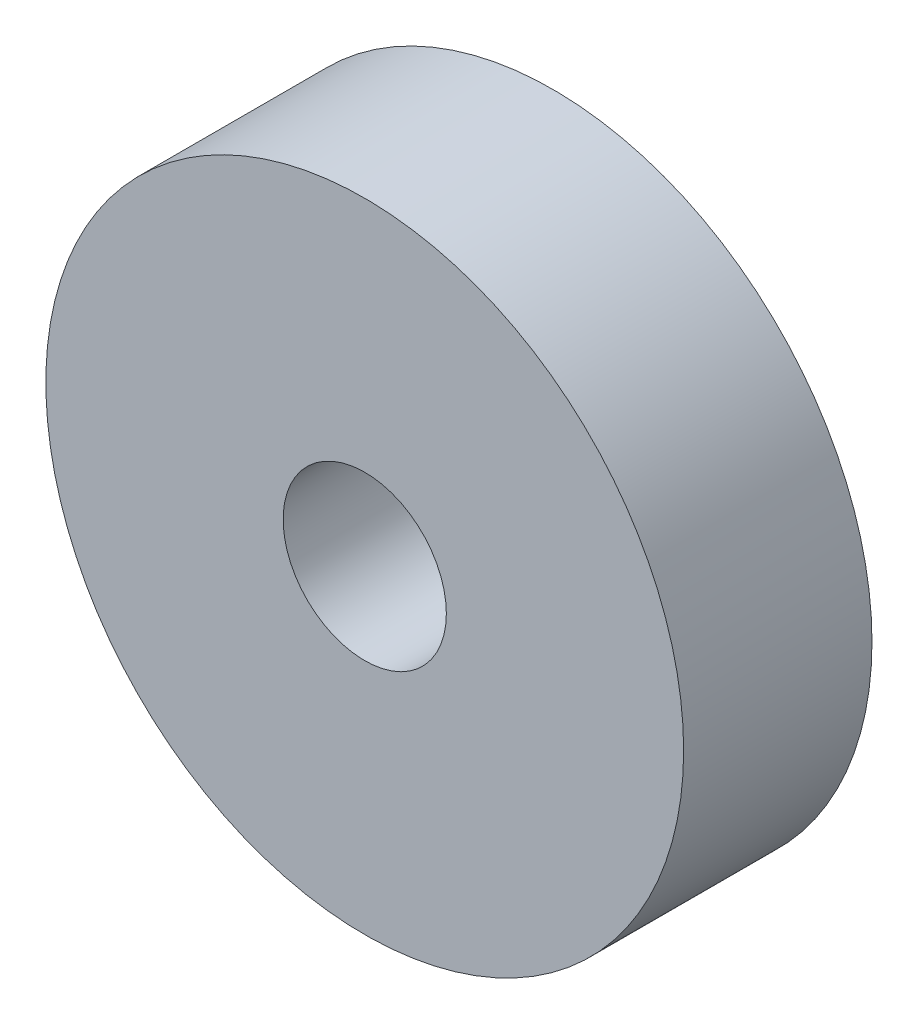
ISO-10303-21;
HEADER;
FILE_DESCRIPTION(('STEP AP214'),'2;1');
FILE_NAME('part.step','',(''),(''),'','','');
FILE_SCHEMA(('AUTOMOTIVE_DESIGN { 1 0 10303 214 1 1 1 1 }'));
ENDSEC;
DATA;
#1=APPLICATION_CONTEXT('core data for automotive mechanical design processes');
#2=APPLICATION_PROTOCOL_DEFINITION('international standard','automotive_design',2000,#1);
#3=PRODUCT_CONTEXT('',#1,'mechanical');
#4=PRODUCT('Part','Part','',(#3));
#5=PRODUCT_RELATED_PRODUCT_CATEGORY('part','',(#4));
#6=PRODUCT_DEFINITION_FORMATION('','',#4);
#7=PRODUCT_DEFINITION_CONTEXT('part definition',#1,'design');
#8=PRODUCT_DEFINITION('design','',#6,#7);
#9=PRODUCT_DEFINITION_SHAPE('','',#8);
#10=(LENGTH_UNIT() NAMED_UNIT(*) SI_UNIT(.MILLI.,.METRE.));
#11=(NAMED_UNIT(*) PLANE_ANGLE_UNIT() SI_UNIT($,.RADIAN.));
#12=(NAMED_UNIT(*) SI_UNIT($,.STERADIAN.) SOLID_ANGLE_UNIT());
#13=UNCERTAINTY_MEASURE_WITH_UNIT(LENGTH_MEASURE(1.E-05),#10,'distance_accuracy_value','');
#14=(GEOMETRIC_REPRESENTATION_CONTEXT(3) GLOBAL_UNCERTAINTY_ASSIGNED_CONTEXT((#13)) GLOBAL_UNIT_ASSIGNED_CONTEXT((#10,
#11,#12)) REPRESENTATION_CONTEXT('',''));
#15=CARTESIAN_POINT('',(0.,0.,0.));
#16=DIRECTION('',(0.,0.,1.));
#17=DIRECTION('',(1.,0.,0.));
#18=AXIS2_PLACEMENT_3D('',#15,#16,#17);
#19=CARTESIAN_POINT('',(0.,0.,3.));
#20=DIRECTION('',(0.,0.,1.));
#21=DIRECTION('',(1.,0.,0.));
#22=AXIS2_PLACEMENT_3D('',#19,#20,#21);
#23=PLANE('',#22);
#24=CARTESIAN_POINT('',(0.,0.,3.));
#25=DIRECTION('',(0.,0.,1.));
#26=DIRECTION('',(1.,0.,0.));
#27=AXIS2_PLACEMENT_3D('',#24,#25,#26);
#28=CIRCLE('',#27,5.08);
#29=CARTESIAN_POINT('',(5.08,0.,3.));
#30=VERTEX_POINT('',#29);
#31=EDGE_CURVE('E10',#30,#30,#28,.T.);
#32=ORIENTED_EDGE('',*,*,#31,.T.);
#33=EDGE_LOOP('',(#32));
#34=FACE_BOUND('',#33,.T.);
#35=CARTESIAN_POINT('',(0.,0.,3.));
#36=DIRECTION('',(0.,0.,1.));
#37=DIRECTION('',(1.,0.,0.));
#38=AXIS2_PLACEMENT_3D('',#35,#36,#37);
#39=CIRCLE('',#38,1.3);
#40=CARTESIAN_POINT('',(1.3,0.,3.));
#41=VERTEX_POINT('',#40);
#42=EDGE_CURVE('E58',#41,#41,#39,.T.);
#43=ORIENTED_EDGE('',*,*,#42,.F.);
#44=EDGE_LOOP('',(#43));
#45=FACE_BOUND('',#44,.T.);
#46=ADVANCED_FACE('F45',(#34,#45),#23,.T.);
#47=CARTESIAN_POINT('',(0.,0.,0.));
#48=DIRECTION('',(0.,0.,1.));
#49=DIRECTION('',(1.,0.,0.));
#50=AXIS2_PLACEMENT_3D('',#47,#48,#49);
#51=PLANE('',#50);
#52=CARTESIAN_POINT('',(0.,0.,0.));
#53=DIRECTION('',(0.,0.,1.));
#54=DIRECTION('',(1.,0.,0.));
#55=AXIS2_PLACEMENT_3D('',#52,#53,#54);
#56=CIRCLE('',#55,5.08);
#57=CARTESIAN_POINT('',(5.08,0.,0.));
#58=VERTEX_POINT('',#57);
#59=EDGE_CURVE('E49',#58,#58,#56,.T.);
#60=ORIENTED_EDGE('',*,*,#59,.F.);
#61=EDGE_LOOP('',(#60));
#62=FACE_BOUND('',#61,.T.);
#63=CARTESIAN_POINT('',(0.,0.,0.));
#64=DIRECTION('',(0.,0.,1.));
#65=DIRECTION('',(1.,0.,0.));
#66=AXIS2_PLACEMENT_3D('',#63,#64,#65);
#67=CIRCLE('',#66,1.3);
#68=CARTESIAN_POINT('',(1.3,0.,0.));
#69=VERTEX_POINT('',#68);
#70=EDGE_CURVE('E60',#69,#69,#67,.T.);
#71=ORIENTED_EDGE('',*,*,#70,.T.);
#72=EDGE_LOOP('',(#71));
#73=FACE_BOUND('',#72,.T.);
#74=ADVANCED_FACE('F72',(#62,#73),#51,.F.);
#75=CARTESIAN_POINT('',(0.,0.,3.));
#76=DIRECTION('',(0.,0.,-1.));
#77=DIRECTION('',(-1.,0.,0.));
#78=AXIS2_PLACEMENT_3D('',#75,#76,#77);
#79=CYLINDRICAL_SURFACE('',#78,5.08);
#80=ORIENTED_EDGE('',*,*,#31,.F.);
#81=EDGE_LOOP('',(#80));
#82=FACE_BOUND('',#81,.T.);
#83=ORIENTED_EDGE('',*,*,#59,.T.);
#84=EDGE_LOOP('',(#83));
#85=FACE_BOUND('',#84,.T.);
#86=ADVANCED_FACE('F47',(#82,#85),#79,.T.);
#87=CARTESIAN_POINT('',(0.,0.,3.));
#88=DIRECTION('',(0.,0.,-1.));
#89=DIRECTION('',(-1.,0.,0.));
#90=AXIS2_PLACEMENT_3D('',#87,#88,#89);
#91=CYLINDRICAL_SURFACE('',#90,1.3);
#92=ORIENTED_EDGE('',*,*,#42,.T.);
#93=EDGE_LOOP('',(#92));
#94=FACE_BOUND('',#93,.T.);
#95=ORIENTED_EDGE('',*,*,#70,.F.);
#96=EDGE_LOOP('',(#95));
#97=FACE_BOUND('',#96,.T.);
#98=ADVANCED_FACE('F68',(#94,#97),#91,.F.);
#99=CLOSED_SHELL('',(#46,#74,#86,#98));
#100=MANIFOLD_SOLID_BREP('B2',#99);
#101=ADVANCED_BREP_SHAPE_REPRESENTATION('',(#18,#100),#14);
#102=SHAPE_DEFINITION_REPRESENTATION(#9,#101);
ENDSEC;
END-ISO-10303-21;
